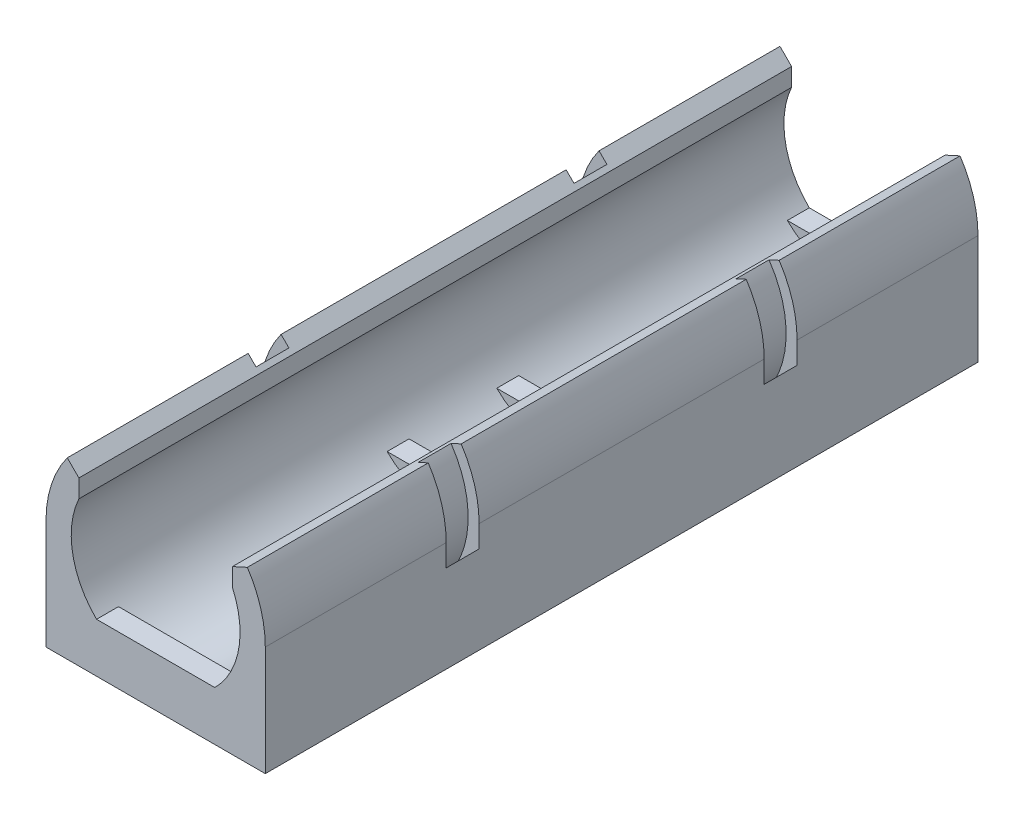
ISO-10303-21;
HEADER;
FILE_DESCRIPTION(('STEP AP214'),'2;1');
FILE_NAME('part.step','',(''),(''),'','','');
FILE_SCHEMA(('AUTOMOTIVE_DESIGN { 1 0 10303 214 1 1 1 1 }'));
ENDSEC;
DATA;
#1=APPLICATION_CONTEXT('core data for automotive mechanical design processes');
#2=APPLICATION_PROTOCOL_DEFINITION('international standard','automotive_design',2000,#1);
#3=PRODUCT_CONTEXT('',#1,'mechanical');
#4=PRODUCT('Part','Part','',(#3));
#5=PRODUCT_RELATED_PRODUCT_CATEGORY('part','',(#4));
#6=PRODUCT_DEFINITION_FORMATION('','',#4);
#7=PRODUCT_DEFINITION_CONTEXT('part definition',#1,'design');
#8=PRODUCT_DEFINITION('design','',#6,#7);
#9=PRODUCT_DEFINITION_SHAPE('','',#8);
#10=(LENGTH_UNIT() NAMED_UNIT(*) SI_UNIT(.MILLI.,.METRE.));
#11=(NAMED_UNIT(*) PLANE_ANGLE_UNIT() SI_UNIT($,.RADIAN.));
#12=(NAMED_UNIT(*) SI_UNIT($,.STERADIAN.) SOLID_ANGLE_UNIT());
#13=UNCERTAINTY_MEASURE_WITH_UNIT(LENGTH_MEASURE(1.E-05),#10,'distance_accuracy_value','');
#14=(GEOMETRIC_REPRESENTATION_CONTEXT(3) GLOBAL_UNCERTAINTY_ASSIGNED_CONTEXT((#13)) GLOBAL_UNIT_ASSIGNED_CONTEXT((#10,
#11,#12)) REPRESENTATION_CONTEXT('',''));
#15=CARTESIAN_POINT('',(0.,0.,0.));
#16=DIRECTION('',(0.,0.,1.));
#17=DIRECTION('',(1.,0.,0.));
#18=AXIS2_PLACEMENT_3D('',#15,#16,#17);
#19=CARTESIAN_POINT('',(10.,10.,32.5));
#20=DIRECTION('',(0.,0.,-1.));
#21=DIRECTION('',(-1.,0.,0.));
#22=AXIS2_PLACEMENT_3D('',#19,#20,#21);
#23=CYLINDRICAL_SURFACE('',#22,10.);
#24=CARTESIAN_POINT('',(10.,10.,16.));
#25=DIRECTION('',(0.,0.,-1.));
#26=DIRECTION('',(-1.,0.,0.));
#27=AXIS2_PLACEMENT_3D('',#24,#25,#26);
#28=CIRCLE('',#27,10.);
#29=CARTESIAN_POINT('',(0.,10.,16.));
#30=VERTEX_POINT('',#29);
#31=CARTESIAN_POINT('',(1.93933982822019,15.9182562968397,16.));
#32=VERTEX_POINT('',#31);
#33=EDGE_CURVE('E374',#30,#32,#28,.T.);
#34=ORIENTED_EDGE('',*,*,#33,.F.);
#35=DIRECTION('',(0.,0.,-1.));
#36=VECTOR('',#35,1.);
#37=CARTESIAN_POINT('',(0.,10.,32.5));
#38=LINE('',#37,#36);
#39=CARTESIAN_POINT('',(0.,10.,32.5));
#40=VERTEX_POINT('',#39);
#41=EDGE_CURVE('E319',#40,#30,#38,.T.);
#42=ORIENTED_EDGE('',*,*,#41,.F.);
#43=CARTESIAN_POINT('',(10.,10.,32.5));
#44=DIRECTION('',(0.,0.,1.));
#45=DIRECTION('',(1.,0.,0.));
#46=AXIS2_PLACEMENT_3D('',#43,#44,#45);
#47=CIRCLE('',#46,10.);
#48=CARTESIAN_POINT('',(1.93933982822018,15.9182562968397,32.5));
#49=VERTEX_POINT('',#48);
#50=EDGE_CURVE('E429',#49,#40,#47,.T.);
#51=ORIENTED_EDGE('',*,*,#50,.F.);
#52=DIRECTION('',(0.,0.,-1.));
#53=VECTOR('',#52,1.);
#54=CARTESIAN_POINT('',(1.93933982822018,15.9182562968397,32.5));
#55=LINE('',#54,#53);
#56=EDGE_CURVE('E324',#49,#32,#55,.T.);
#57=ORIENTED_EDGE('',*,*,#56,.T.);
#58=EDGE_LOOP('',(#34,#42,#51,#57));
#59=FACE_BOUND('',#58,.T.);
#60=ADVANCED_FACE('F36',(#59),#23,.T.);
#61=CARTESIAN_POINT('',(0.,0.,32.5));
#62=DIRECTION('',(0.,1.,0.));
#63=DIRECTION('',(0.,0.,1.));
#64=AXIS2_PLACEMENT_3D('',#61,#62,#63);
#65=PLANE('',#64);
#66=DIRECTION('',(0.,0.,1.));
#67=VECTOR('',#66,1.);
#68=CARTESIAN_POINT('',(4.00000000000003,0.,-16.));
#69=LINE('',#68,#67);
#70=CARTESIAN_POINT('',(4.00000000000003,0.,-13.));
#71=VERTEX_POINT('',#70);
#72=CARTESIAN_POINT('',(4.00000000000003,0.,-16.));
#73=VERTEX_POINT('',#72);
#74=EDGE_CURVE('E488',#71,#73,#69,.F.);
#75=ORIENTED_EDGE('',*,*,#74,.F.);
#76=DIRECTION('',(-1.,0.,0.));
#77=VECTOR('',#76,1.);
#78=CARTESIAN_POINT('',(0.,0.,-13.));
#79=LINE('',#78,#77);
#80=CARTESIAN_POINT('',(16.,0.,-13.));
#81=VERTEX_POINT('',#80);
#82=EDGE_CURVE('E500',#81,#71,#79,.T.);
#83=ORIENTED_EDGE('',*,*,#82,.F.);
#84=DIRECTION('',(0.,0.,1.));
#85=VECTOR('',#84,1.);
#86=CARTESIAN_POINT('',(16.,0.,-16.));
#87=LINE('',#86,#85);
#88=CARTESIAN_POINT('',(16.,0.,-16.));
#89=VERTEX_POINT('',#88);
#90=EDGE_CURVE('E490',#89,#81,#87,.T.);
#91=ORIENTED_EDGE('',*,*,#90,.F.);
#92=DIRECTION('',(-1.,0.,0.));
#93=VECTOR('',#92,1.);
#94=CARTESIAN_POINT('',(0.,0.,-16.));
#95=LINE('',#94,#93);
#96=EDGE_CURVE('E495',#89,#73,#95,.T.);
#97=ORIENTED_EDGE('',*,*,#96,.T.);
#98=EDGE_LOOP('',(#75,#83,#91,#97));
#99=FACE_BOUND('',#98,.T.);
#100=DIRECTION('',(0.,0.,-1.));
#101=VECTOR('',#100,1.);
#102=CARTESIAN_POINT('',(20.,0.,32.5));
#103=LINE('',#102,#101);
#104=CARTESIAN_POINT('',(20.,0.,32.5));
#105=VERTEX_POINT('',#104);
#106=CARTESIAN_POINT('',(20.,0.,-32.5));
#107=VERTEX_POINT('',#106);
#108=EDGE_CURVE('E308',#105,#107,#103,.T.);
#109=ORIENTED_EDGE('',*,*,#108,.F.);
#110=DIRECTION('',(1.,0.,0.));
#111=VECTOR('',#110,1.);
#112=CARTESIAN_POINT('',(0.,0.,32.5));
#113=LINE('',#112,#111);
#114=CARTESIAN_POINT('',(0.,0.,32.5));
#115=VERTEX_POINT('',#114);
#116=EDGE_CURVE('E425',#115,#105,#113,.T.);
#117=ORIENTED_EDGE('',*,*,#116,.F.);
#118=DIRECTION('',(0.,0.,-1.));
#119=VECTOR('',#118,1.);
#120=CARTESIAN_POINT('',(0.,0.,32.5));
#121=LINE('',#120,#119);
#122=CARTESIAN_POINT('',(0.,0.,-32.5));
#123=VERTEX_POINT('',#122);
#124=EDGE_CURVE('E315',#115,#123,#121,.T.);
#125=ORIENTED_EDGE('',*,*,#124,.T.);
#126=DIRECTION('',(1.,0.,0.));
#127=VECTOR('',#126,1.);
#128=CARTESIAN_POINT('',(0.,0.,-32.5));
#129=LINE('',#128,#127);
#130=EDGE_CURVE('E403',#123,#107,#129,.T.);
#131=ORIENTED_EDGE('',*,*,#130,.T.);
#132=EDGE_LOOP('',(#109,#117,#125,#131));
#133=FACE_BOUND('',#132,.T.);
#134=DIRECTION('',(0.,0.,1.));
#135=VECTOR('',#134,1.);
#136=CARTESIAN_POINT('',(4.00000000000003,0.,13.));
#137=LINE('',#136,#135);
#138=CARTESIAN_POINT('',(4.00000000000003,0.,16.));
#139=VERTEX_POINT('',#138);
#140=CARTESIAN_POINT('',(4.00000000000003,0.,13.));
#141=VERTEX_POINT('',#140);
#142=EDGE_CURVE('E539',#139,#141,#137,.F.);
#143=ORIENTED_EDGE('',*,*,#142,.F.);
#144=DIRECTION('',(-1.,0.,0.));
#145=VECTOR('',#144,1.);
#146=CARTESIAN_POINT('',(0.,0.,16.));
#147=LINE('',#146,#145);
#148=CARTESIAN_POINT('',(16.,0.,16.));
#149=VERTEX_POINT('',#148);
#150=EDGE_CURVE('E551',#149,#139,#147,.T.);
#151=ORIENTED_EDGE('',*,*,#150,.F.);
#152=DIRECTION('',(0.,0.,1.));
#153=VECTOR('',#152,1.);
#154=CARTESIAN_POINT('',(16.,0.,13.));
#155=LINE('',#154,#153);
#156=CARTESIAN_POINT('',(16.,0.,13.));
#157=VERTEX_POINT('',#156);
#158=EDGE_CURVE('E543',#157,#149,#155,.T.);
#159=ORIENTED_EDGE('',*,*,#158,.F.);
#160=DIRECTION('',(-1.,0.,0.));
#161=VECTOR('',#160,1.);
#162=CARTESIAN_POINT('',(0.,0.,13.));
#163=LINE('',#162,#161);
#164=EDGE_CURVE('E545',#157,#141,#163,.T.);
#165=ORIENTED_EDGE('',*,*,#164,.T.);
#166=EDGE_LOOP('',(#143,#151,#159,#165));
#167=FACE_BOUND('',#166,.T.);
#168=ADVANCED_FACE('F605',(#99,#133,#167),#65,.F.);
#169=CARTESIAN_POINT('',(10.,10.,32.5));
#170=DIRECTION('',(0.,0.,-1.));
#171=DIRECTION('',(-1.,0.,0.));
#172=AXIS2_PLACEMENT_3D('',#169,#170,#171);
#173=CYLINDRICAL_SURFACE('',#172,10.);
#174=CARTESIAN_POINT('',(18.3647590913067,15.4800369838536,16.));
#175=VERTEX_POINT('',#174);
#176=CARTESIAN_POINT('',(20.,10.,16.));
#177=VERTEX_POINT('',#176);
#178=EDGE_CURVE('E362',#175,#177,#28,.T.);
#179=ORIENTED_EDGE('',*,*,#178,.F.);
#180=DIRECTION('',(0.,0.,-1.));
#181=VECTOR('',#180,1.);
#182=CARTESIAN_POINT('',(18.3647590913067,15.4800369838536,32.5));
#183=LINE('',#182,#181);
#184=CARTESIAN_POINT('',(18.3647590913067,15.4800369838536,32.5));
#185=VERTEX_POINT('',#184);
#186=EDGE_CURVE('E309',#185,#175,#183,.T.);
#187=ORIENTED_EDGE('',*,*,#186,.F.);
#188=CARTESIAN_POINT('',(10.,10.,32.5));
#189=DIRECTION('',(0.,0.,1.));
#190=DIRECTION('',(1.,0.,0.));
#191=AXIS2_PLACEMENT_3D('',#188,#189,#190);
#192=CIRCLE('',#191,10.);
#193=CARTESIAN_POINT('',(20.,10.,32.5));
#194=VERTEX_POINT('',#193);
#195=EDGE_CURVE('E421',#194,#185,#192,.T.);
#196=ORIENTED_EDGE('',*,*,#195,.F.);
#197=DIRECTION('',(0.,0.,-1.));
#198=VECTOR('',#197,1.);
#199=CARTESIAN_POINT('',(20.,10.,32.5));
#200=LINE('',#199,#198);
#201=EDGE_CURVE('E304',#194,#177,#200,.T.);
#202=ORIENTED_EDGE('',*,*,#201,.T.);
#203=EDGE_LOOP('',(#179,#187,#196,#202));
#204=FACE_BOUND('',#203,.T.);
#205=ADVANCED_FACE('F370',(#204),#173,.T.);
#206=CARTESIAN_POINT('',(0.,10.,13.));
#207=VERTEX_POINT('',#206);
#208=CARTESIAN_POINT('',(0.,10.,-13.));
#209=VERTEX_POINT('',#208);
#210=EDGE_CURVE('E323',#207,#209,#38,.T.);
#211=ORIENTED_EDGE('',*,*,#210,.F.);
#212=CARTESIAN_POINT('',(10.,10.,13.));
#213=DIRECTION('',(0.,0.,-1.));
#214=DIRECTION('',(-1.,0.,0.));
#215=AXIS2_PLACEMENT_3D('',#212,#213,#214);
#216=CIRCLE('',#215,10.);
#217=CARTESIAN_POINT('',(1.93933982822019,15.9182562968397,13.));
#218=VERTEX_POINT('',#217);
#219=EDGE_CURVE('E289',#207,#218,#216,.T.);
#220=ORIENTED_EDGE('',*,*,#219,.T.);
#221=CARTESIAN_POINT('',(1.93933982822019,15.9182562968397,-13.));
#222=VERTEX_POINT('',#221);
#223=EDGE_CURVE('E328',#218,#222,#55,.T.);
#224=ORIENTED_EDGE('',*,*,#223,.T.);
#225=CARTESIAN_POINT('',(10.,10.,-13.));
#226=DIRECTION('',(0.,0.,-1.));
#227=DIRECTION('',(-1.,0.,0.));
#228=AXIS2_PLACEMENT_3D('',#225,#226,#227);
#229=CIRCLE('',#228,10.);
#230=EDGE_CURVE('E520',#209,#222,#229,.T.);
#231=ORIENTED_EDGE('',*,*,#230,.F.);
#232=EDGE_LOOP('',(#211,#220,#224,#231));
#233=FACE_BOUND('',#232,.T.);
#234=ADVANCED_FACE('F645',(#233),#23,.T.);
#235=CARTESIAN_POINT('',(18.3647590913067,15.4800369838536,13.));
#236=VERTEX_POINT('',#235);
#237=CARTESIAN_POINT('',(18.3647590913067,15.4800369838536,-13.));
#238=VERTEX_POINT('',#237);
#239=EDGE_CURVE('E297',#236,#238,#183,.T.);
#240=ORIENTED_EDGE('',*,*,#239,.F.);
#241=CARTESIAN_POINT('',(20.,10.,13.));
#242=VERTEX_POINT('',#241);
#243=EDGE_CURVE('E284',#236,#242,#216,.T.);
#244=ORIENTED_EDGE('',*,*,#243,.T.);
#245=CARTESIAN_POINT('',(20.,10.,-13.));
#246=VERTEX_POINT('',#245);
#247=EDGE_CURVE('E295',#242,#246,#200,.T.);
#248=ORIENTED_EDGE('',*,*,#247,.T.);
#249=EDGE_CURVE('E523',#238,#246,#229,.T.);
#250=ORIENTED_EDGE('',*,*,#249,.F.);
#251=EDGE_LOOP('',(#240,#244,#248,#250));
#252=FACE_BOUND('',#251,.T.);
#253=ADVANCED_FACE('F293',(#252),#173,.T.);
#254=CARTESIAN_POINT('',(10.,10.,32.5));
#255=DIRECTION('',(0.,0.,-1.));
#256=DIRECTION('',(-1.,0.,0.));
#257=AXIS2_PLACEMENT_3D('',#254,#255,#256);
#258=CYLINDRICAL_SURFACE('',#257,7.7);
#259=CARTESIAN_POINT('',(10.,10.,4.));
#260=DIRECTION('',(0.,0.,1.));
#261=DIRECTION('',(1.,0.,0.));
#262=AXIS2_PLACEMENT_3D('',#259,#260,#261);
#263=CIRCLE('',#262,7.7);
#264=CARTESIAN_POINT('',(15.388877434123,4.5,4.));
#265=VERTEX_POINT('',#264);
#266=CARTESIAN_POINT('',(4.61112256587703,4.5,4.));
#267=VERTEX_POINT('',#266);
#268=EDGE_CURVE('E463',#265,#267,#263,.F.);
#269=ORIENTED_EDGE('',*,*,#268,.F.);
#270=DIRECTION('',(0.,0.,-1.));
#271=VECTOR('',#270,1.);
#272=CARTESIAN_POINT('',(15.388877434123,4.5,32.5));
#273=LINE('',#272,#271);
#274=CARTESIAN_POINT('',(15.388877434123,4.5,6.));
#275=VERTEX_POINT('',#274);
#276=EDGE_CURVE('E343',#265,#275,#273,.F.);
#277=ORIENTED_EDGE('',*,*,#276,.T.);
#278=CARTESIAN_POINT('',(10.,10.,6.));
#279=DIRECTION('',(0.,0.,1.));
#280=DIRECTION('',(1.,0.,0.));
#281=AXIS2_PLACEMENT_3D('',#278,#279,#280);
#282=CIRCLE('',#281,7.7);
#283=CARTESIAN_POINT('',(4.61112256587703,4.5,6.));
#284=VERTEX_POINT('',#283);
#285=EDGE_CURVE('E466',#275,#284,#282,.F.);
#286=ORIENTED_EDGE('',*,*,#285,.T.);
#287=DIRECTION('',(0.,0.,-1.));
#288=VECTOR('',#287,1.);
#289=CARTESIAN_POINT('',(4.61112256587703,4.5,32.5));
#290=LINE('',#289,#288);
#291=EDGE_CURVE('E340',#284,#267,#290,.T.);
#292=ORIENTED_EDGE('',*,*,#291,.T.);
#293=EDGE_LOOP('',(#269,#277,#286,#292));
#294=FACE_BOUND('',#293,.T.);
#295=CARTESIAN_POINT('',(10.,10.,-5.99999999999999));
#296=DIRECTION('',(0.,0.,1.));
#297=DIRECTION('',(1.,0.,0.));
#298=AXIS2_PLACEMENT_3D('',#295,#296,#297);
#299=CIRCLE('',#298,7.7);
#300=CARTESIAN_POINT('',(15.388877434123,4.5,-5.99999999999999));
#301=VERTEX_POINT('',#300);
#302=CARTESIAN_POINT('',(4.61112256587703,4.5,-5.99999999999999));
#303=VERTEX_POINT('',#302);
#304=EDGE_CURVE('E452',#301,#303,#299,.F.);
#305=ORIENTED_EDGE('',*,*,#304,.F.);
#306=DIRECTION('',(0.,0.,-1.));
#307=VECTOR('',#306,1.);
#308=CARTESIAN_POINT('',(15.388877434123,4.5,32.5));
#309=LINE('',#308,#307);
#310=CARTESIAN_POINT('',(15.388877434123,4.5,-3.99999999999999));
#311=VERTEX_POINT('',#310);
#312=EDGE_CURVE('E337',#301,#311,#309,.F.);
#313=ORIENTED_EDGE('',*,*,#312,.T.);
#314=CARTESIAN_POINT('',(10.,10.,-3.99999999999999));
#315=DIRECTION('',(0.,0.,1.));
#316=DIRECTION('',(1.,0.,0.));
#317=AXIS2_PLACEMENT_3D('',#314,#315,#316);
#318=CIRCLE('',#317,7.7);
#319=CARTESIAN_POINT('',(4.61112256587703,4.5,-3.99999999999999));
#320=VERTEX_POINT('',#319);
#321=EDGE_CURVE('E455',#311,#320,#318,.F.);
#322=ORIENTED_EDGE('',*,*,#321,.T.);
#323=DIRECTION('',(0.,0.,-1.));
#324=VECTOR('',#323,1.);
#325=CARTESIAN_POINT('',(4.61112256587703,4.5,32.5));
#326=LINE('',#325,#324);
#327=EDGE_CURVE('E334',#320,#303,#326,.T.);
#328=ORIENTED_EDGE('',*,*,#327,.T.);
#329=EDGE_LOOP('',(#305,#313,#322,#328));
#330=FACE_BOUND('',#329,.T.);
#331=CARTESIAN_POINT('',(10.,10.,30.5));
#332=DIRECTION('',(0.,0.,-1.));
#333=DIRECTION('',(-1.,0.,0.));
#334=AXIS2_PLACEMENT_3D('',#331,#332,#333);
#335=CIRCLE('',#334,7.7);
#336=CARTESIAN_POINT('',(4.61112256587703,4.5,30.5));
#337=VERTEX_POINT('',#336);
#338=CARTESIAN_POINT('',(15.388877434123,4.5,30.5));
#339=VERTEX_POINT('',#338);
#340=EDGE_CURVE('E474',#337,#339,#335,.F.);
#341=ORIENTED_EDGE('',*,*,#340,.T.);
#342=DIRECTION('',(0.,0.,-1.));
#343=VECTOR('',#342,1.);
#344=CARTESIAN_POINT('',(15.388877434123,4.5,32.5));
#345=LINE('',#344,#343);
#346=CARTESIAN_POINT('',(15.388877434123,4.5,32.5));
#347=VERTEX_POINT('',#346);
#348=EDGE_CURVE('E477',#339,#347,#345,.F.);
#349=ORIENTED_EDGE('',*,*,#348,.T.);
#350=CARTESIAN_POINT('',(10.,10.,32.5));
#351=DIRECTION('',(0.,0.,-1.));
#352=DIRECTION('',(1.,0.,0.));
#353=AXIS2_PLACEMENT_3D('',#350,#351,#352);
#354=CIRCLE('',#353,7.7);
#355=CARTESIAN_POINT('',(17.,13.2078029864691,32.5));
#356=VERTEX_POINT('',#355);
#357=EDGE_CURVE('E435',#356,#347,#354,.T.);
#358=ORIENTED_EDGE('',*,*,#357,.F.);
#359=DIRECTION('',(0.,0.,-1.));
#360=VECTOR('',#359,1.);
#361=CARTESIAN_POINT('',(17.,13.2078029864691,32.5));
#362=LINE('',#361,#360);
#363=CARTESIAN_POINT('',(17.,13.2078029864691,-32.5));
#364=VERTEX_POINT('',#363);
#365=EDGE_CURVE('E385',#356,#364,#362,.T.);
#366=ORIENTED_EDGE('',*,*,#365,.T.);
#367=CARTESIAN_POINT('',(10.,10.,-32.5));
#368=DIRECTION('',(0.,0.,-1.));
#369=DIRECTION('',(1.,0.,0.));
#370=AXIS2_PLACEMENT_3D('',#367,#368,#369);
#371=CIRCLE('',#370,7.7);
#372=CARTESIAN_POINT('',(15.388877434123,4.5,-32.5));
#373=VERTEX_POINT('',#372);
#374=EDGE_CURVE('E415',#364,#373,#371,.T.);
#375=ORIENTED_EDGE('',*,*,#374,.T.);
#376=DIRECTION('',(0.,0.,-1.));
#377=VECTOR('',#376,1.);
#378=CARTESIAN_POINT('',(15.388877434123,4.5,32.5));
#379=LINE('',#378,#377);
#380=CARTESIAN_POINT('',(15.388877434123,4.5,-30.5));
#381=VERTEX_POINT('',#380);
#382=EDGE_CURVE('E441',#373,#381,#379,.F.);
#383=ORIENTED_EDGE('',*,*,#382,.T.);
#384=CARTESIAN_POINT('',(10.,10.,-30.5));
#385=DIRECTION('',(0.,0.,1.));
#386=DIRECTION('',(1.,0.,0.));
#387=AXIS2_PLACEMENT_3D('',#384,#385,#386);
#388=CIRCLE('',#387,7.7);
#389=CARTESIAN_POINT('',(4.61112256587703,4.5,-30.5));
#390=VERTEX_POINT('',#389);
#391=EDGE_CURVE('E438',#381,#390,#388,.F.);
#392=ORIENTED_EDGE('',*,*,#391,.T.);
#393=DIRECTION('',(0.,0.,-1.));
#394=VECTOR('',#393,1.);
#395=CARTESIAN_POINT('',(4.61112256587703,4.5,32.5));
#396=LINE('',#395,#394);
#397=CARTESIAN_POINT('',(4.61112256587703,4.5,-32.5));
#398=VERTEX_POINT('',#397);
#399=EDGE_CURVE('E444',#390,#398,#396,.T.);
#400=ORIENTED_EDGE('',*,*,#399,.T.);
#401=CARTESIAN_POINT('',(3.,13.2078029864691,-32.5));
#402=VERTEX_POINT('',#401);
#403=EDGE_CURVE('E418',#398,#402,#371,.T.);
#404=ORIENTED_EDGE('',*,*,#403,.T.);
#405=DIRECTION('',(0.,0.,-1.));
#406=VECTOR('',#405,1.);
#407=CARTESIAN_POINT('',(3.,13.2078029864691,32.5));
#408=LINE('',#407,#406);
#409=CARTESIAN_POINT('',(3.,13.2078029864691,32.5));
#410=VERTEX_POINT('',#409);
#411=EDGE_CURVE('E331',#410,#402,#408,.T.);
#412=ORIENTED_EDGE('',*,*,#411,.F.);
#413=CARTESIAN_POINT('',(4.61112256587703,4.5,32.5));
#414=VERTEX_POINT('',#413);
#415=EDGE_CURVE('E395',#414,#410,#354,.T.);
#416=ORIENTED_EDGE('',*,*,#415,.F.);
#417=DIRECTION('',(0.,0.,-1.));
#418=VECTOR('',#417,1.);
#419=CARTESIAN_POINT('',(4.61112256587703,4.5,32.5));
#420=LINE('',#419,#418);
#421=EDGE_CURVE('E480',#414,#337,#420,.T.);
#422=ORIENTED_EDGE('',*,*,#421,.T.);
#423=EDGE_LOOP('',(#341,#349,#358,#366,#375,#383,#392,#400,#404,#412,#416,#422));
#424=FACE_BOUND('',#423,.T.);
#425=ADVANCED_FACE('F38',(#294,#330,#424),#258,.F.);
#426=CARTESIAN_POINT('',(3.,13.2078029864691,32.5));
#427=DIRECTION('',(-1.,0.,0.));
#428=DIRECTION('',(0.,0.,1.));
#429=AXIS2_PLACEMENT_3D('',#426,#427,#428);
#430=PLANE('',#429);
#431=DIRECTION('',(0.,1.,0.));
#432=VECTOR('',#431,1.);
#433=CARTESIAN_POINT('',(3.,13.2078029864691,-32.5));
#434=LINE('',#433,#432);
#435=CARTESIAN_POINT('',(3.,14.8575961250599,-32.5));
#436=VERTEX_POINT('',#435);
#437=EDGE_CURVE('E413',#402,#436,#434,.T.);
#438=ORIENTED_EDGE('',*,*,#437,.T.);
#439=DIRECTION('',(0.,0.,-1.));
#440=VECTOR('',#439,1.);
#441=CARTESIAN_POINT('',(3.,14.8575961250599,32.5));
#442=LINE('',#441,#440);
#443=CARTESIAN_POINT('',(3.,14.8575961250599,32.5));
#444=VERTEX_POINT('',#443);
#445=EDGE_CURVE('E327',#444,#436,#442,.T.);
#446=ORIENTED_EDGE('',*,*,#445,.F.);
#447=DIRECTION('',(0.,1.,0.));
#448=VECTOR('',#447,1.);
#449=CARTESIAN_POINT('',(3.,13.2078029864691,32.5));
#450=LINE('',#449,#448);
#451=EDGE_CURVE('E433',#410,#444,#450,.T.);
#452=ORIENTED_EDGE('',*,*,#451,.F.);
#453=ORIENTED_EDGE('',*,*,#411,.T.);
#454=EDGE_LOOP('',(#438,#446,#452,#453));
#455=FACE_BOUND('',#454,.T.);
#456=ADVANCED_FACE('F621',(#455),#430,.F.);
#457=CARTESIAN_POINT('',(3.,14.8575961250599,32.5));
#458=DIRECTION('',(-0.707106781186548,-0.707106781186547,0.));
#459=DIRECTION('',(0.707106781186547,-0.707106781186548,0.));
#460=AXIS2_PLACEMENT_3D('',#457,#458,#459);
#461=PLANE('',#460);
#462=ORIENTED_EDGE('',*,*,#223,.F.);
#463=DIRECTION('',(0.707106781186547,-0.707106781186548,0.));
#464=VECTOR('',#463,1.);
#465=CARTESIAN_POINT('',(3.,14.8575961250599,13.));
#466=LINE('',#465,#464);
#467=CARTESIAN_POINT('',(2.65563885769858,15.2019572673613,13.));
#468=VERTEX_POINT('',#467);
#469=EDGE_CURVE('E548',#218,#468,#466,.T.);
#470=ORIENTED_EDGE('',*,*,#469,.T.);
#471=DIRECTION('',(0.,0.,1.));
#472=VECTOR('',#471,1.);
#473=CARTESIAN_POINT('',(2.65563885769858,15.2019572673613,13.));
#474=LINE('',#473,#472);
#475=CARTESIAN_POINT('',(2.65563885769858,15.2019572673613,16.));
#476=VERTEX_POINT('',#475);
#477=EDGE_CURVE('E555',#468,#476,#474,.T.);
#478=ORIENTED_EDGE('',*,*,#477,.T.);
#479=DIRECTION('',(0.707106781186547,-0.707106781186548,0.));
#480=VECTOR('',#479,1.);
#481=CARTESIAN_POINT('',(3.,14.8575961250599,16.));
#482=LINE('',#481,#480);
#483=EDGE_CURVE('E553',#32,#476,#482,.T.);
#484=ORIENTED_EDGE('',*,*,#483,.F.);
#485=ORIENTED_EDGE('',*,*,#56,.F.);
#486=DIRECTION('',(-0.707106781186547,0.707106781186548,0.));
#487=VECTOR('',#486,1.);
#488=CARTESIAN_POINT('',(3.,14.8575961250599,32.5));
#489=LINE('',#488,#487);
#490=EDGE_CURVE('E431',#444,#49,#489,.T.);
#491=ORIENTED_EDGE('',*,*,#490,.F.);
#492=ORIENTED_EDGE('',*,*,#445,.T.);
#493=DIRECTION('',(-0.707106781186547,0.707106781186548,0.));
#494=VECTOR('',#493,1.);
#495=CARTESIAN_POINT('',(3.,14.8575961250599,-32.5));
#496=LINE('',#495,#494);
#497=CARTESIAN_POINT('',(1.93933982822018,15.9182562968397,-32.5));
#498=VERTEX_POINT('',#497);
#499=EDGE_CURVE('E410',#436,#498,#496,.T.);
#500=ORIENTED_EDGE('',*,*,#499,.T.);
#501=CARTESIAN_POINT('',(1.93933982822019,15.9182562968397,-16.));
#502=VERTEX_POINT('',#501);
#503=EDGE_CURVE('E322',#502,#498,#55,.T.);
#504=ORIENTED_EDGE('',*,*,#503,.F.);
#505=DIRECTION('',(0.707106781186547,-0.707106781186548,0.));
#506=VECTOR('',#505,1.);
#507=CARTESIAN_POINT('',(3.,14.8575961250599,-16.));
#508=LINE('',#507,#506);
#509=CARTESIAN_POINT('',(2.65563885769858,15.2019572673613,-16.));
#510=VERTEX_POINT('',#509);
#511=EDGE_CURVE('E492',#502,#510,#508,.T.);
#512=ORIENTED_EDGE('',*,*,#511,.T.);
#513=DIRECTION('',(0.,0.,1.));
#514=VECTOR('',#513,1.);
#515=CARTESIAN_POINT('',(2.65563885769858,15.2019572673613,-16.));
#516=LINE('',#515,#514);
#517=CARTESIAN_POINT('',(2.65563885769858,15.2019572673613,-13.));
#518=VERTEX_POINT('',#517);
#519=EDGE_CURVE('E502',#510,#518,#516,.T.);
#520=ORIENTED_EDGE('',*,*,#519,.T.);
#521=DIRECTION('',(0.707106781186547,-0.707106781186548,0.));
#522=VECTOR('',#521,1.);
#523=CARTESIAN_POINT('',(3.,14.8575961250599,-13.));
#524=LINE('',#523,#522);
#525=EDGE_CURVE('E498',#222,#518,#524,.T.);
#526=ORIENTED_EDGE('',*,*,#525,.F.);
#527=EDGE_LOOP('',(#462,#470,#478,#484,#485,#491,#492,#500,#504,#512,#520,#526));
#528=FACE_BOUND('',#527,.T.);
#529=ADVANCED_FACE('F578',(#528),#461,.F.);
#530=CARTESIAN_POINT('',(0.,10.,-16.));
#531=VERTEX_POINT('',#530);
#532=CARTESIAN_POINT('',(0.,10.,-32.5));
#533=VERTEX_POINT('',#532);
#534=EDGE_CURVE('E318',#531,#533,#38,.T.);
#535=ORIENTED_EDGE('',*,*,#534,.F.);
#536=CARTESIAN_POINT('',(10.,10.,-16.));
#537=DIRECTION('',(0.,0.,-1.));
#538=DIRECTION('',(-1.,0.,0.));
#539=AXIS2_PLACEMENT_3D('',#536,#537,#538);
#540=CIRCLE('',#539,10.);
#541=EDGE_CURVE('E532',#531,#502,#540,.T.);
#542=ORIENTED_EDGE('',*,*,#541,.T.);
#543=ORIENTED_EDGE('',*,*,#503,.T.);
#544=CARTESIAN_POINT('',(10.,10.,-32.5));
#545=DIRECTION('',(0.,0.,1.));
#546=DIRECTION('',(1.,0.,0.));
#547=AXIS2_PLACEMENT_3D('',#544,#545,#546);
#548=CIRCLE('',#547,10.);
#549=EDGE_CURVE('E407',#498,#533,#548,.T.);
#550=ORIENTED_EDGE('',*,*,#549,.T.);
#551=EDGE_LOOP('',(#535,#542,#543,#550));
#552=FACE_BOUND('',#551,.T.);
#553=ADVANCED_FACE('F586',(#552),#23,.T.);
#554=CARTESIAN_POINT('',(0.,0.,32.5));
#555=DIRECTION('',(1.,0.,0.));
#556=DIRECTION('',(0.,1.,0.));
#557=AXIS2_PLACEMENT_3D('',#554,#555,#556);
#558=PLANE('',#557);
#559=DIRECTION('',(0.,0.,1.));
#560=VECTOR('',#559,1.);
#561=CARTESIAN_POINT('',(0.,8.00000000000001,13.));
#562=LINE('',#561,#560);
#563=CARTESIAN_POINT('',(0.,8.00000000000002,13.));
#564=VERTEX_POINT('',#563);
#565=CARTESIAN_POINT('',(0.,8.00000000000001,16.));
#566=VERTEX_POINT('',#565);
#567=EDGE_CURVE('E560',#564,#566,#562,.T.);
#568=ORIENTED_EDGE('',*,*,#567,.F.);
#569=DIRECTION('',(0.,1.,0.));
#570=VECTOR('',#569,1.);
#571=CARTESIAN_POINT('',(0.,10.,13.));
#572=LINE('',#571,#570);
#573=EDGE_CURVE('E59',#564,#207,#572,.T.);
#574=ORIENTED_EDGE('',*,*,#573,.T.);
#575=ORIENTED_EDGE('',*,*,#210,.T.);
#576=DIRECTION('',(0.,1.,0.));
#577=VECTOR('',#576,1.);
#578=CARTESIAN_POINT('',(0.,10.,-13.));
#579=LINE('',#578,#577);
#580=CARTESIAN_POINT('',(0.,8.00000000000001,-13.));
#581=VERTEX_POINT('',#580);
#582=EDGE_CURVE('E511',#581,#209,#579,.T.);
#583=ORIENTED_EDGE('',*,*,#582,.F.);
#584=DIRECTION('',(0.,0.,1.));
#585=VECTOR('',#584,1.);
#586=CARTESIAN_POINT('',(0.,8.00000000000001,-16.));
#587=LINE('',#586,#585);
#588=CARTESIAN_POINT('',(0.,8.00000000000002,-16.));
#589=VERTEX_POINT('',#588);
#590=EDGE_CURVE('E507',#589,#581,#587,.T.);
#591=ORIENTED_EDGE('',*,*,#590,.F.);
#592=DIRECTION('',(0.,1.,0.));
#593=VECTOR('',#592,1.);
#594=CARTESIAN_POINT('',(0.,10.,-16.));
#595=LINE('',#594,#593);
#596=EDGE_CURVE('E510',#589,#531,#595,.T.);
#597=ORIENTED_EDGE('',*,*,#596,.T.);
#598=ORIENTED_EDGE('',*,*,#534,.T.);
#599=DIRECTION('',(0.,-1.,0.));
#600=VECTOR('',#599,1.);
#601=CARTESIAN_POINT('',(0.,0.,-32.5));
#602=LINE('',#601,#600);
#603=EDGE_CURVE('E405',#533,#123,#602,.T.);
#604=ORIENTED_EDGE('',*,*,#603,.T.);
#605=ORIENTED_EDGE('',*,*,#124,.F.);
#606=DIRECTION('',(0.,-1.,0.));
#607=VECTOR('',#606,1.);
#608=CARTESIAN_POINT('',(0.,0.,32.5));
#609=LINE('',#608,#607);
#610=EDGE_CURVE('E427',#40,#115,#609,.T.);
#611=ORIENTED_EDGE('',*,*,#610,.F.);
#612=ORIENTED_EDGE('',*,*,#41,.T.);
#613=DIRECTION('',(0.,1.,0.));
#614=VECTOR('',#613,1.);
#615=CARTESIAN_POINT('',(0.,10.,16.));
#616=LINE('',#615,#614);
#617=EDGE_CURVE('E298',#566,#30,#616,.T.);
#618=ORIENTED_EDGE('',*,*,#617,.F.);
#619=EDGE_LOOP('',(#568,#574,#575,#583,#591,#597,#598,#604,#605,#611,#612,#618));
#620=FACE_BOUND('',#619,.T.);
#621=ADVANCED_FACE('F600',(#620),#558,.F.);
#622=CARTESIAN_POINT('',(20.,0.,32.5));
#623=DIRECTION('',(-1.,0.,0.));
#624=DIRECTION('',(0.,-1.,0.));
#625=AXIS2_PLACEMENT_3D('',#622,#623,#624);
#626=PLANE('',#625);
#627=ORIENTED_EDGE('',*,*,#247,.F.);
#628=DIRECTION('',(0.,-1.,0.));
#629=VECTOR('',#628,1.);
#630=CARTESIAN_POINT('',(20.,10.,13.));
#631=LINE('',#630,#629);
#632=CARTESIAN_POINT('',(20.,8.00000000000001,13.));
#633=VERTEX_POINT('',#632);
#634=EDGE_CURVE('E280',#242,#633,#631,.T.);
#635=ORIENTED_EDGE('',*,*,#634,.T.);
#636=DIRECTION('',(0.,0.,1.));
#637=VECTOR('',#636,1.);
#638=CARTESIAN_POINT('',(20.,8.00000000000001,13.));
#639=LINE('',#638,#637);
#640=CARTESIAN_POINT('',(20.,8.00000000000001,16.));
#641=VERTEX_POINT('',#640);
#642=EDGE_CURVE('E558',#633,#641,#639,.T.);
#643=ORIENTED_EDGE('',*,*,#642,.T.);
#644=DIRECTION('',(0.,-1.,0.));
#645=VECTOR('',#644,1.);
#646=CARTESIAN_POINT('',(20.,10.,16.));
#647=LINE('',#646,#645);
#648=EDGE_CURVE('E568',#177,#641,#647,.T.);
#649=ORIENTED_EDGE('',*,*,#648,.F.);
#650=ORIENTED_EDGE('',*,*,#201,.F.);
#651=DIRECTION('',(0.,1.,0.));
#652=VECTOR('',#651,1.);
#653=CARTESIAN_POINT('',(20.,0.,32.5));
#654=LINE('',#653,#652);
#655=EDGE_CURVE('E423',#105,#194,#654,.T.);
#656=ORIENTED_EDGE('',*,*,#655,.F.);
#657=ORIENTED_EDGE('',*,*,#108,.T.);
#658=DIRECTION('',(0.,1.,0.));
#659=VECTOR('',#658,1.);
#660=CARTESIAN_POINT('',(20.,0.,-32.5));
#661=LINE('',#660,#659);
#662=CARTESIAN_POINT('',(20.,10.,-32.5));
#663=VERTEX_POINT('',#662);
#664=EDGE_CURVE('E400',#107,#663,#661,.T.);
#665=ORIENTED_EDGE('',*,*,#664,.T.);
#666=CARTESIAN_POINT('',(20.,10.,-16.));
#667=VERTEX_POINT('',#666);
#668=EDGE_CURVE('E305',#667,#663,#200,.T.);
#669=ORIENTED_EDGE('',*,*,#668,.F.);
#670=DIRECTION('',(0.,-1.,0.));
#671=VECTOR('',#670,1.);
#672=CARTESIAN_POINT('',(20.,10.,-16.));
#673=LINE('',#672,#671);
#674=CARTESIAN_POINT('',(20.,8.00000000000001,-16.));
#675=VERTEX_POINT('',#674);
#676=EDGE_CURVE('E529',#667,#675,#673,.T.);
#677=ORIENTED_EDGE('',*,*,#676,.T.);
#678=DIRECTION('',(0.,0.,1.));
#679=VECTOR('',#678,1.);
#680=CARTESIAN_POINT('',(20.,8.00000000000001,-16.));
#681=LINE('',#680,#679);
#682=CARTESIAN_POINT('',(20.,8.00000000000001,-13.));
#683=VERTEX_POINT('',#682);
#684=EDGE_CURVE('E505',#675,#683,#681,.T.);
#685=ORIENTED_EDGE('',*,*,#684,.T.);
#686=DIRECTION('',(0.,-1.,0.));
#687=VECTOR('',#686,1.);
#688=CARTESIAN_POINT('',(20.,10.,-13.));
#689=LINE('',#688,#687);
#690=EDGE_CURVE('E303',#246,#683,#689,.T.);
#691=ORIENTED_EDGE('',*,*,#690,.F.);
#692=EDGE_LOOP('',(#627,#635,#643,#649,#650,#656,#657,#665,#669,#677,#685,#691));
#693=FACE_BOUND('',#692,.T.);
#694=ADVANCED_FACE('F301',(#693),#626,.F.);
#695=CARTESIAN_POINT('',(18.3647590913067,15.4800369838536,-16.));
#696=VERTEX_POINT('',#695);
#697=CARTESIAN_POINT('',(18.3647590913067,15.4800369838536,-32.5));
#698=VERTEX_POINT('',#697);
#699=EDGE_CURVE('E380',#696,#698,#183,.T.);
#700=ORIENTED_EDGE('',*,*,#699,.F.);
#701=EDGE_CURVE('E514',#696,#667,#540,.T.);
#702=ORIENTED_EDGE('',*,*,#701,.T.);
#703=ORIENTED_EDGE('',*,*,#668,.T.);
#704=CARTESIAN_POINT('',(10.,10.,-32.5));
#705=DIRECTION('',(0.,0.,1.));
#706=DIRECTION('',(1.,0.,0.));
#707=AXIS2_PLACEMENT_3D('',#704,#705,#706);
#708=CIRCLE('',#707,10.);
#709=EDGE_CURVE('E398',#663,#698,#708,.T.);
#710=ORIENTED_EDGE('',*,*,#709,.T.);
#711=EDGE_LOOP('',(#700,#702,#703,#710));
#712=FACE_BOUND('',#711,.T.);
#713=ADVANCED_FACE('F671',(#712),#173,.T.);
#714=CARTESIAN_POINT('',(17.,14.8575961250599,32.5));
#715=DIRECTION('',(0.41496057252912,-0.909839394204441,0.));
#716=DIRECTION('',(0.909839394204442,0.41496057252912,0.));
#717=AXIS2_PLACEMENT_3D('',#714,#715,#716);
#718=PLANE('',#717);
#719=DIRECTION('',(0.,0.,1.));
#720=VECTOR('',#719,1.);
#721=CARTESIAN_POINT('',(17.443091964941,15.0596820059595,13.));
#722=LINE('',#721,#720);
#723=CARTESIAN_POINT('',(17.443091964941,15.0596820059595,16.));
#724=VERTEX_POINT('',#723);
#725=CARTESIAN_POINT('',(17.443091964941,15.0596820059595,13.));
#726=VERTEX_POINT('',#725);
#727=EDGE_CURVE('E355',#724,#726,#722,.F.);
#728=ORIENTED_EDGE('',*,*,#727,.T.);
#729=DIRECTION('',(0.909839394204442,0.41496057252912,0.));
#730=VECTOR('',#729,1.);
#731=CARTESIAN_POINT('',(17.,14.8575961250599,13.));
#732=LINE('',#731,#730);
#733=EDGE_CURVE('E11',#726,#236,#732,.T.);
#734=ORIENTED_EDGE('',*,*,#733,.T.);
#735=ORIENTED_EDGE('',*,*,#239,.T.);
#736=DIRECTION('',(0.909839394204442,0.41496057252912,0.));
#737=VECTOR('',#736,1.);
#738=CARTESIAN_POINT('',(17.,14.8575961250599,-13.));
#739=LINE('',#738,#737);
#740=CARTESIAN_POINT('',(17.443091964941,15.0596820059595,-13.));
#741=VERTEX_POINT('',#740);
#742=EDGE_CURVE('E349',#741,#238,#739,.T.);
#743=ORIENTED_EDGE('',*,*,#742,.F.);
#744=DIRECTION('',(0.,0.,1.));
#745=VECTOR('',#744,1.);
#746=CARTESIAN_POINT('',(17.443091964941,15.0596820059595,-16.));
#747=LINE('',#746,#745);
#748=CARTESIAN_POINT('',(17.443091964941,15.0596820059595,-16.));
#749=VERTEX_POINT('',#748);
#750=EDGE_CURVE('E346',#741,#749,#747,.F.);
#751=ORIENTED_EDGE('',*,*,#750,.T.);
#752=DIRECTION('',(0.909839394204442,0.41496057252912,0.));
#753=VECTOR('',#752,1.);
#754=CARTESIAN_POINT('',(17.,14.8575961250599,-16.));
#755=LINE('',#754,#753);
#756=EDGE_CURVE('E352',#749,#696,#755,.T.);
#757=ORIENTED_EDGE('',*,*,#756,.T.);
#758=ORIENTED_EDGE('',*,*,#699,.T.);
#759=DIRECTION('',(-0.909839394204441,-0.41496057252912,0.));
#760=VECTOR('',#759,1.);
#761=CARTESIAN_POINT('',(17.,14.8575961250599,-32.5));
#762=LINE('',#761,#760);
#763=CARTESIAN_POINT('',(17.,14.8575961250599,-32.5));
#764=VERTEX_POINT('',#763);
#765=EDGE_CURVE('E396',#698,#764,#762,.T.);
#766=ORIENTED_EDGE('',*,*,#765,.T.);
#767=DIRECTION('',(0.,0.,-1.));
#768=VECTOR('',#767,1.);
#769=CARTESIAN_POINT('',(17.,14.8575961250599,32.5));
#770=LINE('',#769,#768);
#771=CARTESIAN_POINT('',(17.,14.8575961250599,32.5));
#772=VERTEX_POINT('',#771);
#773=EDGE_CURVE('E381',#772,#764,#770,.T.);
#774=ORIENTED_EDGE('',*,*,#773,.F.);
#775=DIRECTION('',(-0.909839394204441,-0.41496057252912,0.));
#776=VECTOR('',#775,1.);
#777=CARTESIAN_POINT('',(17.,14.8575961250599,32.5));
#778=LINE('',#777,#776);
#779=EDGE_CURVE('E379',#185,#772,#778,.T.);
#780=ORIENTED_EDGE('',*,*,#779,.F.);
#781=ORIENTED_EDGE('',*,*,#186,.T.);
#782=DIRECTION('',(0.909839394204442,0.41496057252912,0.));
#783=VECTOR('',#782,1.);
#784=CARTESIAN_POINT('',(17.,14.8575961250599,16.));
#785=LINE('',#784,#783);
#786=EDGE_CURVE('E44',#724,#175,#785,.T.);
#787=ORIENTED_EDGE('',*,*,#786,.F.);
#788=EDGE_LOOP('',(#728,#734,#735,#743,#751,#757,#758,#766,#774,#780,#781,#787));
#789=FACE_BOUND('',#788,.T.);
#790=ADVANCED_FACE('F377',(#789),#718,.F.);
#791=CARTESIAN_POINT('',(17.,13.2078029864691,32.5));
#792=DIRECTION('',(1.,0.,0.));
#793=DIRECTION('',(0.,1.,0.));
#794=AXIS2_PLACEMENT_3D('',#791,#792,#793);
#795=PLANE('',#794);
#796=DIRECTION('',(0.,-1.,0.));
#797=VECTOR('',#796,1.);
#798=CARTESIAN_POINT('',(17.,13.2078029864691,-32.5));
#799=LINE('',#798,#797);
#800=EDGE_CURVE('E393',#764,#364,#799,.T.);
#801=ORIENTED_EDGE('',*,*,#800,.T.);
#802=ORIENTED_EDGE('',*,*,#365,.F.);
#803=DIRECTION('',(0.,-1.,0.));
#804=VECTOR('',#803,1.);
#805=CARTESIAN_POINT('',(17.,13.2078029864691,32.5));
#806=LINE('',#805,#804);
#807=EDGE_CURVE('E390',#772,#356,#806,.T.);
#808=ORIENTED_EDGE('',*,*,#807,.F.);
#809=ORIENTED_EDGE('',*,*,#773,.T.);
#810=EDGE_LOOP('',(#801,#802,#808,#809));
#811=FACE_BOUND('',#810,.T.);
#812=ADVANCED_FACE('F716',(#811),#795,.F.);
#813=CARTESIAN_POINT('',(10.,10.,32.5));
#814=DIRECTION('',(0.,0.,1.));
#815=DIRECTION('',(1.,0.,0.));
#816=AXIS2_PLACEMENT_3D('',#813,#814,#815);
#817=PLANE('',#816);
#818=ORIENTED_EDGE('',*,*,#116,.T.);
#819=ORIENTED_EDGE('',*,*,#655,.T.);
#820=ORIENTED_EDGE('',*,*,#195,.T.);
#821=ORIENTED_EDGE('',*,*,#779,.T.);
#822=ORIENTED_EDGE('',*,*,#807,.T.);
#823=ORIENTED_EDGE('',*,*,#357,.T.);
#824=DIRECTION('',(1.,0.,0.));
#825=VECTOR('',#824,1.);
#826=CARTESIAN_POINT('',(2.30000000000001,4.5,32.5));
#827=LINE('',#826,#825);
#828=EDGE_CURVE('E483',#414,#347,#827,.T.);
#829=ORIENTED_EDGE('',*,*,#828,.F.);
#830=ORIENTED_EDGE('',*,*,#415,.T.);
#831=ORIENTED_EDGE('',*,*,#451,.T.);
#832=ORIENTED_EDGE('',*,*,#490,.T.);
#833=ORIENTED_EDGE('',*,*,#50,.T.);
#834=ORIENTED_EDGE('',*,*,#610,.T.);
#835=EDGE_LOOP('',(#818,#819,#820,#821,#822,#823,#829,#830,#831,#832,#833,#834));
#836=FACE_BOUND('',#835,.T.);
#837=ADVANCED_FACE('F609',(#836),#817,.T.);
#838=CARTESIAN_POINT('',(10.,10.,-32.5));
#839=DIRECTION('',(0.,0.,1.));
#840=DIRECTION('',(1.,0.,0.));
#841=AXIS2_PLACEMENT_3D('',#838,#839,#840);
#842=PLANE('',#841);
#843=ORIENTED_EDGE('',*,*,#664,.F.);
#844=ORIENTED_EDGE('',*,*,#130,.F.);
#845=ORIENTED_EDGE('',*,*,#603,.F.);
#846=ORIENTED_EDGE('',*,*,#549,.F.);
#847=ORIENTED_EDGE('',*,*,#499,.F.);
#848=ORIENTED_EDGE('',*,*,#437,.F.);
#849=ORIENTED_EDGE('',*,*,#403,.F.);
#850=DIRECTION('',(-1.,0.,0.));
#851=VECTOR('',#850,1.);
#852=CARTESIAN_POINT('',(17.7,4.5,-32.5));
#853=LINE('',#852,#851);
#854=EDGE_CURVE('E450',#373,#398,#853,.T.);
#855=ORIENTED_EDGE('',*,*,#854,.F.);
#856=ORIENTED_EDGE('',*,*,#374,.F.);
#857=ORIENTED_EDGE('',*,*,#800,.F.);
#858=ORIENTED_EDGE('',*,*,#765,.F.);
#859=ORIENTED_EDGE('',*,*,#709,.F.);
#860=EDGE_LOOP('',(#843,#844,#845,#846,#847,#848,#849,#855,#856,#857,#858,#859));
#861=FACE_BOUND('',#860,.T.);
#862=ADVANCED_FACE('F595',(#861),#842,.F.);
#863=CARTESIAN_POINT('',(17.7,4.5,-30.5));
#864=DIRECTION('',(0.,0.,1.));
#865=DIRECTION('',(1.,0.,0.));
#866=AXIS2_PLACEMENT_3D('',#863,#864,#865);
#867=PLANE('',#866);
#868=ORIENTED_EDGE('',*,*,#391,.F.);
#869=DIRECTION('',(-1.,0.,0.));
#870=VECTOR('',#869,1.);
#871=CARTESIAN_POINT('',(17.7,4.5,-30.5));
#872=LINE('',#871,#870);
#873=EDGE_CURVE('E447',#381,#390,#872,.T.);
#874=ORIENTED_EDGE('',*,*,#873,.T.);
#875=EDGE_LOOP('',(#868,#874));
#876=FACE_BOUND('',#875,.T.);
#877=ADVANCED_FACE('F630',(#876),#867,.T.);
#878=CARTESIAN_POINT('',(0.,4.5,0.));
#879=DIRECTION('',(0.,1.,0.));
#880=DIRECTION('',(0.,0.,1.));
#881=AXIS2_PLACEMENT_3D('',#878,#879,#880);
#882=PLANE('',#881);
#883=ORIENTED_EDGE('',*,*,#382,.F.);
#884=ORIENTED_EDGE('',*,*,#854,.T.);
#885=ORIENTED_EDGE('',*,*,#399,.F.);
#886=ORIENTED_EDGE('',*,*,#873,.F.);
#887=EDGE_LOOP('',(#883,#884,#885,#886));
#888=FACE_BOUND('',#887,.T.);
#889=ADVANCED_FACE('F628',(#888),#882,.T.);
#890=CARTESIAN_POINT('',(0.,4.5,0.));
#891=DIRECTION('',(0.,1.,0.));
#892=DIRECTION('',(0.,0.,1.));
#893=AXIS2_PLACEMENT_3D('',#890,#891,#892);
#894=PLANE('',#893);
#895=ORIENTED_EDGE('',*,*,#312,.F.);
#896=DIRECTION('',(-1.,0.,0.));
#897=VECTOR('',#896,1.);
#898=CARTESIAN_POINT('',(17.7,4.5,-5.99999999999999));
#899=LINE('',#898,#897);
#900=EDGE_CURVE('E458',#301,#303,#899,.T.);
#901=ORIENTED_EDGE('',*,*,#900,.T.);
#902=ORIENTED_EDGE('',*,*,#327,.F.);
#903=DIRECTION('',(-1.,0.,0.));
#904=VECTOR('',#903,1.);
#905=CARTESIAN_POINT('',(17.7,4.5,-3.99999999999999));
#906=LINE('',#905,#904);
#907=EDGE_CURVE('E460',#311,#320,#906,.T.);
#908=ORIENTED_EDGE('',*,*,#907,.F.);
#909=EDGE_LOOP('',(#895,#901,#902,#908));
#910=FACE_BOUND('',#909,.T.);
#911=ADVANCED_FACE('F638',(#910),#894,.T.);
#912=CARTESIAN_POINT('',(17.7,4.5,-5.99999999999999));
#913=DIRECTION('',(0.,0.,1.));
#914=DIRECTION('',(1.,0.,0.));
#915=AXIS2_PLACEMENT_3D('',#912,#913,#914);
#916=PLANE('',#915);
#917=ORIENTED_EDGE('',*,*,#900,.F.);
#918=ORIENTED_EDGE('',*,*,#304,.T.);
#919=EDGE_LOOP('',(#917,#918));
#920=FACE_BOUND('',#919,.T.);
#921=ADVANCED_FACE('F677',(#920),#916,.F.);
#922=CARTESIAN_POINT('',(17.7,4.5,-3.99999999999999));
#923=DIRECTION('',(0.,0.,1.));
#924=DIRECTION('',(1.,0.,0.));
#925=AXIS2_PLACEMENT_3D('',#922,#923,#924);
#926=PLANE('',#925);
#927=ORIENTED_EDGE('',*,*,#321,.F.);
#928=ORIENTED_EDGE('',*,*,#907,.T.);
#929=EDGE_LOOP('',(#927,#928));
#930=FACE_BOUND('',#929,.T.);
#931=ADVANCED_FACE('F681',(#930),#926,.T.);
#932=CARTESIAN_POINT('',(0.,4.5,0.));
#933=DIRECTION('',(0.,1.,0.));
#934=DIRECTION('',(0.,0.,1.));
#935=AXIS2_PLACEMENT_3D('',#932,#933,#934);
#936=PLANE('',#935);
#937=ORIENTED_EDGE('',*,*,#276,.F.);
#938=DIRECTION('',(-1.,0.,0.));
#939=VECTOR('',#938,1.);
#940=CARTESIAN_POINT('',(17.7,4.5,4.));
#941=LINE('',#940,#939);
#942=EDGE_CURVE('E469',#265,#267,#941,.T.);
#943=ORIENTED_EDGE('',*,*,#942,.T.);
#944=ORIENTED_EDGE('',*,*,#291,.F.);
#945=DIRECTION('',(-1.,0.,0.));
#946=VECTOR('',#945,1.);
#947=CARTESIAN_POINT('',(17.7,4.5,6.));
#948=LINE('',#947,#946);
#949=EDGE_CURVE('E471',#275,#284,#948,.T.);
#950=ORIENTED_EDGE('',*,*,#949,.F.);
#951=EDGE_LOOP('',(#937,#943,#944,#950));
#952=FACE_BOUND('',#951,.T.);
#953=ADVANCED_FACE('F683',(#952),#936,.T.);
#954=CARTESIAN_POINT('',(17.7,4.5,4.));
#955=DIRECTION('',(0.,0.,1.));
#956=DIRECTION('',(1.,0.,0.));
#957=AXIS2_PLACEMENT_3D('',#954,#955,#956);
#958=PLANE('',#957);
#959=ORIENTED_EDGE('',*,*,#942,.F.);
#960=ORIENTED_EDGE('',*,*,#268,.T.);
#961=EDGE_LOOP('',(#959,#960));
#962=FACE_BOUND('',#961,.T.);
#963=ADVANCED_FACE('F691',(#962),#958,.F.);
#964=CARTESIAN_POINT('',(17.7,4.5,6.));
#965=DIRECTION('',(0.,0.,1.));
#966=DIRECTION('',(1.,0.,0.));
#967=AXIS2_PLACEMENT_3D('',#964,#965,#966);
#968=PLANE('',#967);
#969=ORIENTED_EDGE('',*,*,#285,.F.);
#970=ORIENTED_EDGE('',*,*,#949,.T.);
#971=EDGE_LOOP('',(#969,#970));
#972=FACE_BOUND('',#971,.T.);
#973=ADVANCED_FACE('F743',(#972),#968,.T.);
#974=CARTESIAN_POINT('',(2.30000000000001,4.5,30.5));
#975=DIRECTION('',(0.,0.,-1.));
#976=DIRECTION('',(-1.,0.,0.));
#977=AXIS2_PLACEMENT_3D('',#974,#975,#976);
#978=PLANE('',#977);
#979=ORIENTED_EDGE('',*,*,#340,.F.);
#980=DIRECTION('',(1.,0.,0.));
#981=VECTOR('',#980,1.);
#982=CARTESIAN_POINT('',(2.30000000000001,4.5,30.5));
#983=LINE('',#982,#981);
#984=EDGE_CURVE('E485',#337,#339,#983,.T.);
#985=ORIENTED_EDGE('',*,*,#984,.T.);
#986=EDGE_LOOP('',(#979,#985));
#987=FACE_BOUND('',#986,.T.);
#988=ADVANCED_FACE('F747',(#987),#978,.T.);
#989=CARTESIAN_POINT('',(0.,4.5,0.));
#990=DIRECTION('',(0.,1.,0.));
#991=DIRECTION('',(0.,0.,1.));
#992=AXIS2_PLACEMENT_3D('',#989,#990,#991);
#993=PLANE('',#992);
#994=ORIENTED_EDGE('',*,*,#348,.F.);
#995=ORIENTED_EDGE('',*,*,#984,.F.);
#996=ORIENTED_EDGE('',*,*,#421,.F.);
#997=ORIENTED_EDGE('',*,*,#828,.T.);
#998=EDGE_LOOP('',(#994,#995,#996,#997));
#999=FACE_BOUND('',#998,.T.);
#1000=ADVANCED_FACE('F756',(#999),#993,.T.);
#1001=CARTESIAN_POINT('',(10.,8.00000000000001,-16.));
#1002=DIRECTION('',(0.,0.,1.));
#1003=DIRECTION('',(1.,0.,0.));
#1004=AXIS2_PLACEMENT_3D('',#1001,#1002,#1003);
#1005=CYLINDRICAL_SURFACE('',#1004,10.);
#1006=ORIENTED_EDGE('',*,*,#74,.T.);
#1007=CARTESIAN_POINT('',(10.,8.00000000000001,-16.));
#1008=DIRECTION('',(0.,0.,-1.));
#1009=DIRECTION('',(-1.,0.,0.));
#1010=AXIS2_PLACEMENT_3D('',#1007,#1008,#1009);
#1011=CIRCLE('',#1010,10.);
#1012=EDGE_CURVE('E528',#73,#589,#1011,.T.);
#1013=ORIENTED_EDGE('',*,*,#1012,.T.);
#1014=ORIENTED_EDGE('',*,*,#590,.T.);
#1015=CARTESIAN_POINT('',(10.,8.00000000000001,-13.));
#1016=DIRECTION('',(0.,0.,-1.));
#1017=DIRECTION('',(-1.,0.,0.));
#1018=AXIS2_PLACEMENT_3D('',#1015,#1016,#1017);
#1019=CIRCLE('',#1018,10.);
#1020=EDGE_CURVE('E518',#71,#581,#1019,.T.);
#1021=ORIENTED_EDGE('',*,*,#1020,.F.);
#1022=EDGE_LOOP('',(#1006,#1013,#1014,#1021));
#1023=FACE_BOUND('',#1022,.T.);
#1024=ADVANCED_FACE('F760',(#1023),#1005,.F.);
#1025=ORIENTED_EDGE('',*,*,#90,.T.);
#1026=EDGE_CURVE('E515',#683,#81,#1019,.T.);
#1027=ORIENTED_EDGE('',*,*,#1026,.F.);
#1028=ORIENTED_EDGE('',*,*,#684,.F.);
#1029=EDGE_CURVE('E526',#675,#89,#1011,.T.);
#1030=ORIENTED_EDGE('',*,*,#1029,.T.);
#1031=EDGE_LOOP('',(#1025,#1027,#1028,#1030));
#1032=FACE_BOUND('',#1031,.T.);
#1033=ADVANCED_FACE('F827',(#1032),#1005,.F.);
#1034=CARTESIAN_POINT('',(10.,10.,-16.));
#1035=DIRECTION('',(0.,0.,-1.));
#1036=DIRECTION('',(-1.,0.,0.));
#1037=AXIS2_PLACEMENT_3D('',#1034,#1035,#1036);
#1038=PLANE('',#1037);
#1039=ORIENTED_EDGE('',*,*,#541,.F.);
#1040=ORIENTED_EDGE('',*,*,#596,.F.);
#1041=ORIENTED_EDGE('',*,*,#1012,.F.);
#1042=ORIENTED_EDGE('',*,*,#96,.F.);
#1043=ORIENTED_EDGE('',*,*,#1029,.F.);
#1044=ORIENTED_EDGE('',*,*,#676,.F.);
#1045=ORIENTED_EDGE('',*,*,#701,.F.);
#1046=ORIENTED_EDGE('',*,*,#756,.F.);
#1047=CARTESIAN_POINT('',(10.,10.,-16.));
#1048=DIRECTION('',(0.,0.,-1.));
#1049=DIRECTION('',(-1.,0.,0.));
#1050=AXIS2_PLACEMENT_3D('',#1047,#1048,#1049);
#1051=CIRCLE('',#1050,9.);
#1052=EDGE_CURVE('E538',#749,#510,#1051,.T.);
#1053=ORIENTED_EDGE('',*,*,#1052,.T.);
#1054=ORIENTED_EDGE('',*,*,#511,.F.);
#1055=EDGE_LOOP('',(#1039,#1040,#1041,#1042,#1043,#1044,#1045,#1046,#1053,#1054));
#1056=FACE_BOUND('',#1055,.T.);
#1057=ADVANCED_FACE('F837',(#1056),#1038,.F.);
#1058=CARTESIAN_POINT('',(10.,10.,-13.));
#1059=DIRECTION('',(0.,0.,-1.));
#1060=DIRECTION('',(-1.,0.,0.));
#1061=AXIS2_PLACEMENT_3D('',#1058,#1059,#1060);
#1062=PLANE('',#1061);
#1063=ORIENTED_EDGE('',*,*,#525,.T.);
#1064=CARTESIAN_POINT('',(10.,10.,-13.));
#1065=DIRECTION('',(0.,0.,-1.));
#1066=DIRECTION('',(-1.,0.,0.));
#1067=AXIS2_PLACEMENT_3D('',#1064,#1065,#1066);
#1068=CIRCLE('',#1067,9.);
#1069=EDGE_CURVE('E535',#741,#518,#1068,.T.);
#1070=ORIENTED_EDGE('',*,*,#1069,.F.);
#1071=ORIENTED_EDGE('',*,*,#742,.T.);
#1072=ORIENTED_EDGE('',*,*,#249,.T.);
#1073=ORIENTED_EDGE('',*,*,#690,.T.);
#1074=ORIENTED_EDGE('',*,*,#1026,.T.);
#1075=ORIENTED_EDGE('',*,*,#82,.T.);
#1076=ORIENTED_EDGE('',*,*,#1020,.T.);
#1077=ORIENTED_EDGE('',*,*,#582,.T.);
#1078=ORIENTED_EDGE('',*,*,#230,.T.);
#1079=EDGE_LOOP('',(#1063,#1070,#1071,#1072,#1073,#1074,#1075,#1076,#1077,#1078));
#1080=FACE_BOUND('',#1079,.T.);
#1081=ADVANCED_FACE('F846',(#1080),#1062,.T.);
#1082=CARTESIAN_POINT('',(10.,10.,-16.));
#1083=DIRECTION('',(0.,0.,1.));
#1084=DIRECTION('',(1.,0.,0.));
#1085=AXIS2_PLACEMENT_3D('',#1082,#1083,#1084);
#1086=CYLINDRICAL_SURFACE('',#1085,9.);
#1087=ORIENTED_EDGE('',*,*,#1052,.F.);
#1088=ORIENTED_EDGE('',*,*,#750,.F.);
#1089=ORIENTED_EDGE('',*,*,#1069,.T.);
#1090=ORIENTED_EDGE('',*,*,#519,.F.);
#1091=EDGE_LOOP('',(#1087,#1088,#1089,#1090));
#1092=FACE_BOUND('',#1091,.T.);
#1093=ADVANCED_FACE('F856',(#1092),#1086,.T.);
#1094=CARTESIAN_POINT('',(10.,8.00000000000001,13.));
#1095=DIRECTION('',(0.,0.,1.));
#1096=DIRECTION('',(1.,0.,0.));
#1097=AXIS2_PLACEMENT_3D('',#1094,#1095,#1096);
#1098=CYLINDRICAL_SURFACE('',#1097,10.);
#1099=ORIENTED_EDGE('',*,*,#142,.T.);
#1100=CARTESIAN_POINT('',(10.,8.00000000000001,13.));
#1101=DIRECTION('',(0.,0.,-1.));
#1102=DIRECTION('',(-1.,0.,0.));
#1103=AXIS2_PLACEMENT_3D('',#1100,#1101,#1102);
#1104=CIRCLE('',#1103,10.);
#1105=EDGE_CURVE('E288',#141,#564,#1104,.T.);
#1106=ORIENTED_EDGE('',*,*,#1105,.T.);
#1107=ORIENTED_EDGE('',*,*,#567,.T.);
#1108=CARTESIAN_POINT('',(10.,8.00000000000001,16.));
#1109=DIRECTION('',(0.,0.,-1.));
#1110=DIRECTION('',(-1.,0.,0.));
#1111=AXIS2_PLACEMENT_3D('',#1108,#1109,#1110);
#1112=CIRCLE('',#1111,10.);
#1113=EDGE_CURVE('E567',#139,#566,#1112,.T.);
#1114=ORIENTED_EDGE('',*,*,#1113,.F.);
#1115=EDGE_LOOP('',(#1099,#1106,#1107,#1114));
#1116=FACE_BOUND('',#1115,.T.);
#1117=ADVANCED_FACE('F865',(#1116),#1098,.F.);
#1118=ORIENTED_EDGE('',*,*,#158,.T.);
#1119=EDGE_CURVE('E564',#641,#149,#1112,.T.);
#1120=ORIENTED_EDGE('',*,*,#1119,.F.);
#1121=ORIENTED_EDGE('',*,*,#642,.F.);
#1122=EDGE_CURVE('E51',#633,#157,#1104,.T.);
#1123=ORIENTED_EDGE('',*,*,#1122,.T.);
#1124=EDGE_LOOP('',(#1118,#1120,#1121,#1123));
#1125=FACE_BOUND('',#1124,.T.);
#1126=ADVANCED_FACE('F875',(#1125),#1098,.F.);
#1127=CARTESIAN_POINT('',(10.,10.,13.));
#1128=DIRECTION('',(0.,0.,-1.));
#1129=DIRECTION('',(-1.,0.,0.));
#1130=AXIS2_PLACEMENT_3D('',#1127,#1128,#1129);
#1131=PLANE('',#1130);
#1132=ORIENTED_EDGE('',*,*,#1122,.F.);
#1133=ORIENTED_EDGE('',*,*,#634,.F.);
#1134=ORIENTED_EDGE('',*,*,#243,.F.);
#1135=ORIENTED_EDGE('',*,*,#733,.F.);
#1136=CARTESIAN_POINT('',(10.,10.,13.));
#1137=DIRECTION('',(0.,0.,-1.));
#1138=DIRECTION('',(-1.,0.,0.));
#1139=AXIS2_PLACEMENT_3D('',#1136,#1137,#1138);
#1140=CIRCLE('',#1139,9.);
#1141=EDGE_CURVE('E375',#726,#468,#1140,.T.);
#1142=ORIENTED_EDGE('',*,*,#1141,.T.);
#1143=ORIENTED_EDGE('',*,*,#469,.F.);
#1144=ORIENTED_EDGE('',*,*,#219,.F.);
#1145=ORIENTED_EDGE('',*,*,#573,.F.);
#1146=ORIENTED_EDGE('',*,*,#1105,.F.);
#1147=ORIENTED_EDGE('',*,*,#164,.F.);
#1148=EDGE_LOOP('',(#1132,#1133,#1134,#1135,#1142,#1143,#1144,#1145,#1146,#1147));
#1149=FACE_BOUND('',#1148,.T.);
#1150=ADVANCED_FACE('F282',(#1149),#1131,.F.);
#1151=CARTESIAN_POINT('',(10.,10.,16.));
#1152=DIRECTION('',(0.,0.,-1.));
#1153=DIRECTION('',(-1.,0.,0.));
#1154=AXIS2_PLACEMENT_3D('',#1151,#1152,#1153);
#1155=PLANE('',#1154);
#1156=ORIENTED_EDGE('',*,*,#150,.T.);
#1157=ORIENTED_EDGE('',*,*,#1113,.T.);
#1158=ORIENTED_EDGE('',*,*,#617,.T.);
#1159=ORIENTED_EDGE('',*,*,#33,.T.);
#1160=ORIENTED_EDGE('',*,*,#483,.T.);
#1161=CARTESIAN_POINT('',(10.,10.,16.));
#1162=DIRECTION('',(0.,0.,-1.));
#1163=DIRECTION('',(-1.,0.,0.));
#1164=AXIS2_PLACEMENT_3D('',#1161,#1162,#1163);
#1165=CIRCLE('',#1164,9.);
#1166=EDGE_CURVE('E365',#724,#476,#1165,.T.);
#1167=ORIENTED_EDGE('',*,*,#1166,.F.);
#1168=ORIENTED_EDGE('',*,*,#786,.T.);
#1169=ORIENTED_EDGE('',*,*,#178,.T.);
#1170=ORIENTED_EDGE('',*,*,#648,.T.);
#1171=ORIENTED_EDGE('',*,*,#1119,.T.);
#1172=EDGE_LOOP('',(#1156,#1157,#1158,#1159,#1160,#1167,#1168,#1169,#1170,#1171));
#1173=FACE_BOUND('',#1172,.T.);
#1174=ADVANCED_FACE('F361',(#1173),#1155,.T.);
#1175=CARTESIAN_POINT('',(10.,10.,13.));
#1176=DIRECTION('',(0.,0.,1.));
#1177=DIRECTION('',(1.,0.,0.));
#1178=AXIS2_PLACEMENT_3D('',#1175,#1176,#1177);
#1179=CYLINDRICAL_SURFACE('',#1178,9.);
#1180=ORIENTED_EDGE('',*,*,#1141,.F.);
#1181=ORIENTED_EDGE('',*,*,#727,.F.);
#1182=ORIENTED_EDGE('',*,*,#1166,.T.);
#1183=ORIENTED_EDGE('',*,*,#477,.F.);
#1184=EDGE_LOOP('',(#1180,#1181,#1182,#1183));
#1185=FACE_BOUND('',#1184,.T.);
#1186=ADVANCED_FACE('F900',(#1185),#1179,.T.);
#1187=CLOSED_SHELL('',(#60,#168,#205,#234,#253,#425,#456,#529,#553,#621,#694,#713,#790,#812,
#837,#862,#877,#889,#911,#921,#931,#953,#963,#973,#988,#1000,#1024,#1033,#1057,#1081,#1093,
#1117,#1126,#1150,#1174,#1186));
#1188=MANIFOLD_SOLID_BREP('B2',#1187);
#1189=ADVANCED_BREP_SHAPE_REPRESENTATION('',(#18,#1188),#14);
#1190=SHAPE_DEFINITION_REPRESENTATION(#9,#1189);
ENDSEC;
END-ISO-10303-21;
